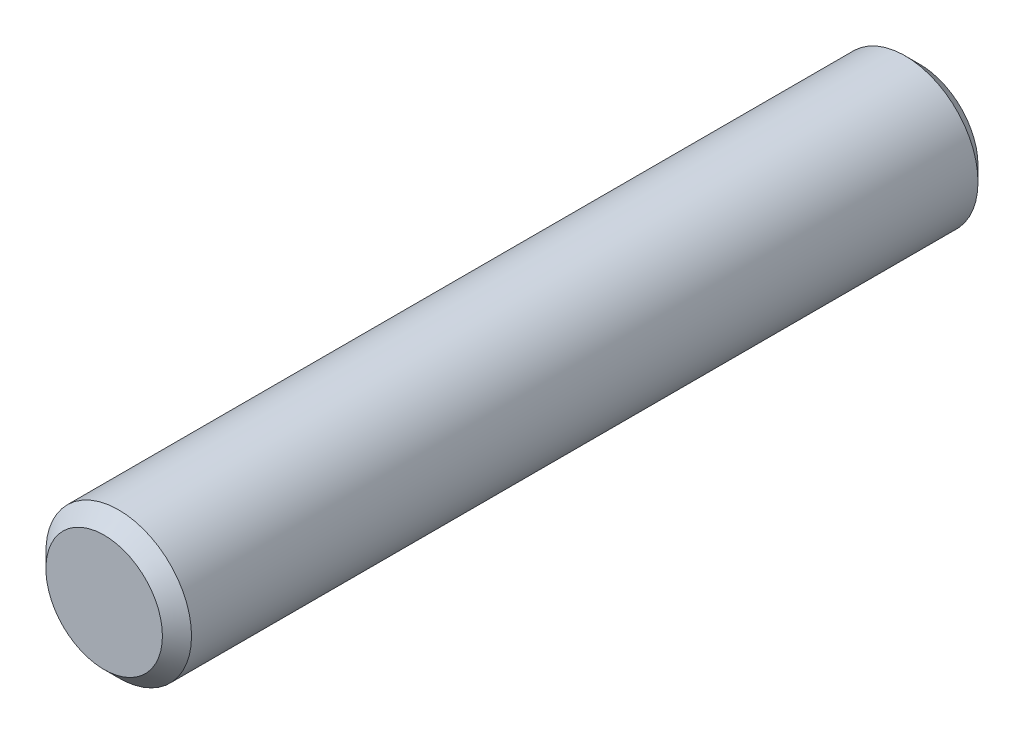
ISO-10303-21;
HEADER;
FILE_DESCRIPTION(('STEP AP214'),'2;1');
FILE_NAME('part.step','',(''),(''),'','','');
FILE_SCHEMA(('AUTOMOTIVE_DESIGN { 1 0 10303 214 1 1 1 1 }'));
ENDSEC;
DATA;
#1=APPLICATION_CONTEXT('core data for automotive mechanical design processes');
#2=APPLICATION_PROTOCOL_DEFINITION('international standard','automotive_design',2000,#1);
#3=PRODUCT_CONTEXT('',#1,'mechanical');
#4=PRODUCT('Part','Part','',(#3));
#5=PRODUCT_RELATED_PRODUCT_CATEGORY('part','',(#4));
#6=PRODUCT_DEFINITION_FORMATION('','',#4);
#7=PRODUCT_DEFINITION_CONTEXT('part definition',#1,'design');
#8=PRODUCT_DEFINITION('design','',#6,#7);
#9=PRODUCT_DEFINITION_SHAPE('','',#8);
#10=(LENGTH_UNIT() NAMED_UNIT(*) SI_UNIT(.MILLI.,.METRE.));
#11=(NAMED_UNIT(*) PLANE_ANGLE_UNIT() SI_UNIT($,.RADIAN.));
#12=(NAMED_UNIT(*) SI_UNIT($,.STERADIAN.) SOLID_ANGLE_UNIT());
#13=UNCERTAINTY_MEASURE_WITH_UNIT(LENGTH_MEASURE(1.E-05),#10,'distance_accuracy_value','');
#14=(GEOMETRIC_REPRESENTATION_CONTEXT(3) GLOBAL_UNCERTAINTY_ASSIGNED_CONTEXT((#13)) GLOBAL_UNIT_ASSIGNED_CONTEXT((#10,
#11,#12)) REPRESENTATION_CONTEXT('',''));
#15=CARTESIAN_POINT('',(0.,0.,0.));
#16=DIRECTION('',(0.,0.,1.));
#17=DIRECTION('',(1.,0.,0.));
#18=AXIS2_PLACEMENT_3D('',#15,#16,#17);
#19=CARTESIAN_POINT('',(0.,0.,14.));
#20=DIRECTION('',(0.,0.,-1.));
#21=DIRECTION('',(-1.,0.,0.));
#22=AXIS2_PLACEMENT_3D('',#19,#20,#21);
#23=CYLINDRICAL_SURFACE('',#22,2.5);
#24=CARTESIAN_POINT('',(0.,0.,-13.5));
#25=DIRECTION('',(0.,0.,1.));
#26=DIRECTION('',(1.,0.,0.));
#27=AXIS2_PLACEMENT_3D('',#24,#25,#26);
#28=CIRCLE('',#27,2.5);
#29=CARTESIAN_POINT('',(2.5,0.,-13.5));
#30=VERTEX_POINT('',#29);
#31=EDGE_CURVE('E45',#30,#30,#28,.T.);
#32=ORIENTED_EDGE('',*,*,#31,.T.);
#33=EDGE_LOOP('',(#32));
#34=FACE_BOUND('',#33,.T.);
#35=CARTESIAN_POINT('',(0.,0.,13.5));
#36=DIRECTION('',(0.,0.,1.));
#37=DIRECTION('',(1.,0.,0.));
#38=AXIS2_PLACEMENT_3D('',#35,#36,#37);
#39=CIRCLE('',#38,2.5);
#40=CARTESIAN_POINT('',(2.5,0.,13.5));
#41=VERTEX_POINT('',#40);
#42=EDGE_CURVE('E49',#41,#41,#39,.F.);
#43=ORIENTED_EDGE('',*,*,#42,.T.);
#44=EDGE_LOOP('',(#43));
#45=FACE_BOUND('',#44,.T.);
#46=ADVANCED_FACE('F33',(#34,#45),#23,.T.);
#47=CARTESIAN_POINT('',(0.,0.,14.));
#48=DIRECTION('',(0.,0.,1.));
#49=DIRECTION('',(1.,0.,0.));
#50=AXIS2_PLACEMENT_3D('',#47,#48,#49);
#51=PLANE('',#50);
#52=CARTESIAN_POINT('',(0.,0.,14.));
#53=DIRECTION('',(0.,0.,1.));
#54=DIRECTION('',(1.,0.,0.));
#55=AXIS2_PLACEMENT_3D('',#52,#53,#54);
#56=CIRCLE('',#55,2.);
#57=CARTESIAN_POINT('',(2.,0.,14.));
#58=VERTEX_POINT('',#57);
#59=EDGE_CURVE('E10',#58,#58,#56,.T.);
#60=ORIENTED_EDGE('',*,*,#59,.T.);
#61=EDGE_LOOP('',(#60));
#62=FACE_BOUND('',#61,.T.);
#63=ADVANCED_FACE('F65',(#62),#51,.T.);
#64=CARTESIAN_POINT('',(0.,0.,-14.));
#65=DIRECTION('',(0.,0.,1.));
#66=DIRECTION('',(1.,0.,0.));
#67=AXIS2_PLACEMENT_3D('',#64,#65,#66);
#68=PLANE('',#67);
#69=CARTESIAN_POINT('',(0.,0.,-14.));
#70=DIRECTION('',(0.,0.,1.));
#71=DIRECTION('',(1.,0.,0.));
#72=AXIS2_PLACEMENT_3D('',#69,#70,#71);
#73=CIRCLE('',#72,2.);
#74=CARTESIAN_POINT('',(2.,0.,-14.));
#75=VERTEX_POINT('',#74);
#76=EDGE_CURVE('E41',#75,#75,#73,.F.);
#77=ORIENTED_EDGE('',*,*,#76,.T.);
#78=EDGE_LOOP('',(#77));
#79=FACE_BOUND('',#78,.T.);
#80=ADVANCED_FACE('F62',(#79),#68,.F.);
#81=CARTESIAN_POINT('',(0.,0.,-13.5));
#82=DIRECTION('',(0.,0.,1.));
#83=DIRECTION('',(1.,0.,0.));
#84=AXIS2_PLACEMENT_3D('',#81,#82,#83);
#85=CONICAL_SURFACE('',#84,2.5,0.785398163397453);
#86=ORIENTED_EDGE('',*,*,#76,.F.);
#87=EDGE_LOOP('',(#86));
#88=FACE_BOUND('',#87,.T.);
#89=ORIENTED_EDGE('',*,*,#31,.F.);
#90=EDGE_LOOP('',(#89));
#91=FACE_BOUND('',#90,.T.);
#92=ADVANCED_FACE('F58',(#88,#91),#85,.T.);
#93=CARTESIAN_POINT('',(0.,0.,14.));
#94=DIRECTION('',(0.,0.,-1.));
#95=DIRECTION('',(-1.,0.,0.));
#96=AXIS2_PLACEMENT_3D('',#93,#94,#95);
#97=CONICAL_SURFACE('',#96,2.,0.785398163397447);
#98=ORIENTED_EDGE('',*,*,#42,.F.);
#99=EDGE_LOOP('',(#98));
#100=FACE_BOUND('',#99,.T.);
#101=ORIENTED_EDGE('',*,*,#59,.F.);
#102=EDGE_LOOP('',(#101));
#103=FACE_BOUND('',#102,.T.);
#104=ADVANCED_FACE('F36',(#100,#103),#97,.T.);
#105=CLOSED_SHELL('',(#46,#63,#80,#92,#104));
#106=MANIFOLD_SOLID_BREP('B2',#105);
#107=ADVANCED_BREP_SHAPE_REPRESENTATION('',(#18,#106),#14);
#108=SHAPE_DEFINITION_REPRESENTATION(#9,#107);
ENDSEC;
END-ISO-10303-21;
